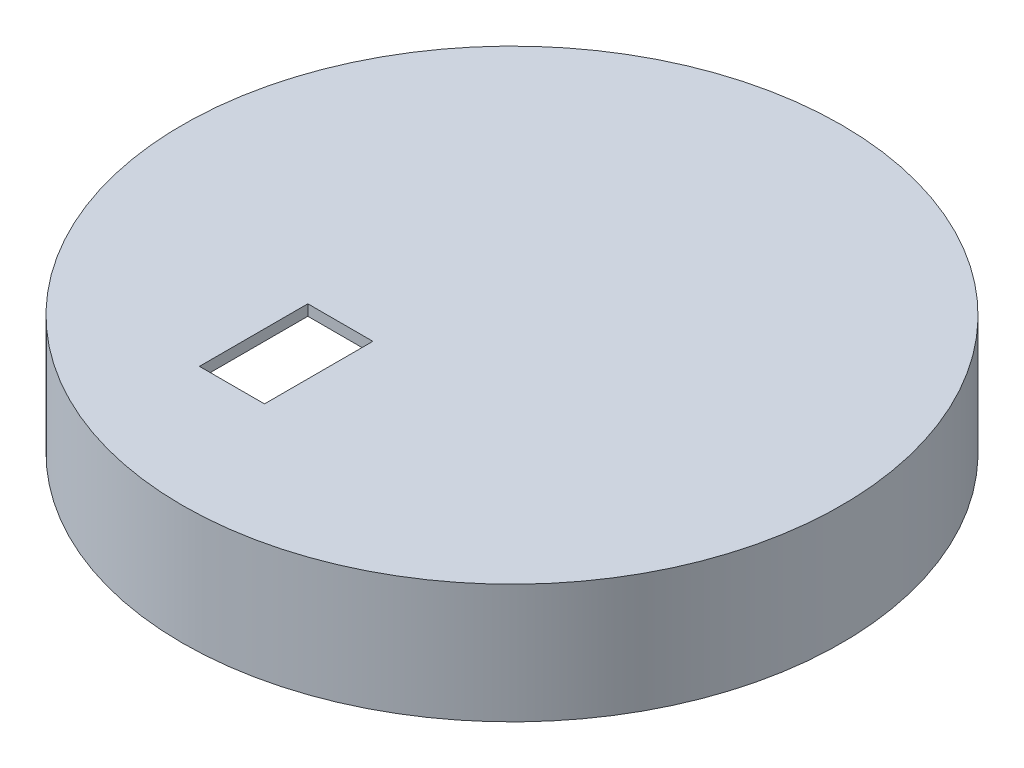
ISO-10303-21;
HEADER;
FILE_DESCRIPTION(('STEP AP214'),'2;1');
FILE_NAME('part.step','',(''),(''),'','','');
FILE_SCHEMA(('AUTOMOTIVE_DESIGN { 1 0 10303 214 1 1 1 1 }'));
ENDSEC;
DATA;
#1=APPLICATION_CONTEXT('core data for automotive mechanical design processes');
#2=APPLICATION_PROTOCOL_DEFINITION('international standard','automotive_design',2000,#1);
#3=PRODUCT_CONTEXT('',#1,'mechanical');
#4=PRODUCT('Part','Part','',(#3));
#5=PRODUCT_RELATED_PRODUCT_CATEGORY('part','',(#4));
#6=PRODUCT_DEFINITION_FORMATION('','',#4);
#7=PRODUCT_DEFINITION_CONTEXT('part definition',#1,'design');
#8=PRODUCT_DEFINITION('design','',#6,#7);
#9=PRODUCT_DEFINITION_SHAPE('','',#8);
#10=(LENGTH_UNIT() NAMED_UNIT(*) SI_UNIT(.MILLI.,.METRE.));
#11=(NAMED_UNIT(*) PLANE_ANGLE_UNIT() SI_UNIT($,.RADIAN.));
#12=(NAMED_UNIT(*) SI_UNIT($,.STERADIAN.) SOLID_ANGLE_UNIT());
#13=UNCERTAINTY_MEASURE_WITH_UNIT(LENGTH_MEASURE(1.E-05),#10,'distance_accuracy_value','');
#14=(GEOMETRIC_REPRESENTATION_CONTEXT(3) GLOBAL_UNCERTAINTY_ASSIGNED_CONTEXT((#13)) GLOBAL_UNIT_ASSIGNED_CONTEXT((#10,
#11,#12)) REPRESENTATION_CONTEXT('',''));
#15=CARTESIAN_POINT('',(0.,0.,0.));
#16=DIRECTION('',(0.,0.,1.));
#17=DIRECTION('',(1.,0.,0.));
#18=AXIS2_PLACEMENT_3D('',#15,#16,#17);
#19=CARTESIAN_POINT('',(0.,10.,0.));
#20=DIRECTION('',(0.,-1.,0.));
#21=DIRECTION('',(0.,0.,-1.));
#22=AXIS2_PLACEMENT_3D('',#19,#20,#21);
#23=CYLINDRICAL_SURFACE('',#22,28.405);
#24=CARTESIAN_POINT('',(0.,10.,0.));
#25=DIRECTION('',(0.,1.,0.));
#26=DIRECTION('',(0.,0.,1.));
#27=AXIS2_PLACEMENT_3D('',#24,#25,#26);
#28=CIRCLE('',#27,28.405);
#29=CARTESIAN_POINT('',(-28.1267895308821,10.,3.96582093461893));
#30=VERTEX_POINT('',#29);
#31=CARTESIAN_POINT('',(28.1267895308821,10.,3.96582093461893));
#32=VERTEX_POINT('',#31);
#33=EDGE_CURVE('E178',#30,#32,#28,.T.);
#34=ORIENTED_EDGE('',*,*,#33,.T.);
#35=DIRECTION('',(0.,1.,0.));
#36=VECTOR('',#35,1.);
#37=CARTESIAN_POINT('',(28.1267895308821,-9.32952303175249,3.96582093461893));
#38=LINE('',#37,#36);
#39=CARTESIAN_POINT('',(28.1267895308821,0.,3.96582093461894));
#40=VERTEX_POINT('',#39);
#41=EDGE_CURVE('E157',#40,#32,#38,.T.);
#42=ORIENTED_EDGE('',*,*,#41,.F.);
#43=CARTESIAN_POINT('',(0.,0.,0.));
#44=DIRECTION('',(0.,1.,0.));
#45=DIRECTION('',(0.,0.,1.));
#46=AXIS2_PLACEMENT_3D('',#43,#44,#45);
#47=CIRCLE('',#46,28.405);
#48=CARTESIAN_POINT('',(-28.1267895308821,0.,3.96582093461893));
#49=VERTEX_POINT('',#48);
#50=EDGE_CURVE('E45',#49,#40,#47,.T.);
#51=ORIENTED_EDGE('',*,*,#50,.F.);
#52=DIRECTION('',(0.,1.,0.));
#53=VECTOR('',#52,1.);
#54=CARTESIAN_POINT('',(-28.1267895308821,-9.32952303175249,3.96582093461893));
#55=LINE('',#54,#53);
#56=EDGE_CURVE('E167',#49,#30,#55,.T.);
#57=ORIENTED_EDGE('',*,*,#56,.T.);
#58=EDGE_LOOP('',(#34,#42,#51,#57));
#59=FACE_BOUND('',#58,.T.);
#60=ADVANCED_FACE('F37',(#59),#23,.F.);
#61=CARTESIAN_POINT('',(28.1267895308821,0.,-3.96582093461894));
#62=VERTEX_POINT('',#61);
#63=CARTESIAN_POINT('',(-28.1267895308821,0.,-3.96582093461893));
#64=VERTEX_POINT('',#63);
#65=EDGE_CURVE('E180',#62,#64,#47,.T.);
#66=ORIENTED_EDGE('',*,*,#65,.F.);
#67=DIRECTION('',(0.,1.,0.));
#68=VECTOR('',#67,1.);
#69=CARTESIAN_POINT('',(28.1267895308821,-9.32952303175249,-3.96582093461893));
#70=LINE('',#69,#68);
#71=CARTESIAN_POINT('',(28.1267895308821,10.,-3.96582093461893));
#72=VERTEX_POINT('',#71);
#73=EDGE_CURVE('E154',#62,#72,#70,.T.);
#74=ORIENTED_EDGE('',*,*,#73,.T.);
#75=CARTESIAN_POINT('',(-28.1267895308821,10.,-3.96582093461893));
#76=VERTEX_POINT('',#75);
#77=EDGE_CURVE('E177',#72,#76,#28,.T.);
#78=ORIENTED_EDGE('',*,*,#77,.T.);
#79=DIRECTION('',(0.,1.,0.));
#80=VECTOR('',#79,1.);
#81=CARTESIAN_POINT('',(-28.1267895308821,-9.32952303175249,-3.96582093461893));
#82=LINE('',#81,#80);
#83=EDGE_CURVE('E170',#64,#76,#82,.T.);
#84=ORIENTED_EDGE('',*,*,#83,.F.);
#85=EDGE_LOOP('',(#66,#74,#78,#84));
#86=FACE_BOUND('',#85,.T.);
#87=ADVANCED_FACE('F193',(#86),#23,.F.);
#88=CARTESIAN_POINT('',(0.,10.,0.));
#89=DIRECTION('',(0.,1.,0.));
#90=DIRECTION('',(0.,0.,1.));
#91=AXIS2_PLACEMENT_3D('',#88,#89,#90);
#92=PLANE('',#91);
#93=DIRECTION('',(1.,0.,0.));
#94=VECTOR('',#93,1.);
#95=CARTESIAN_POINT('',(0.,10.,18.5083099009989));
#96=LINE('',#95,#94);
#97=CARTESIAN_POINT('',(-10.3287789718393,10.,18.5083099009989));
#98=VERTEX_POINT('',#97);
#99=CARTESIAN_POINT('',(-4.32877897183926,10.,18.5083099009989));
#100=VERTEX_POINT('',#99);
#101=EDGE_CURVE('E133',#98,#100,#96,.T.);
#102=ORIENTED_EDGE('',*,*,#101,.T.);
#103=DIRECTION('',(0.,0.,-1.));
#104=VECTOR('',#103,1.);
#105=CARTESIAN_POINT('',(-4.32877897183926,10.,0.));
#106=LINE('',#105,#104);
#107=CARTESIAN_POINT('',(-4.32877897183926,10.,8.50830990099894));
#108=VERTEX_POINT('',#107);
#109=EDGE_CURVE('E136',#100,#108,#106,.T.);
#110=ORIENTED_EDGE('',*,*,#109,.T.);
#111=DIRECTION('',(-1.,0.,0.));
#112=VECTOR('',#111,1.);
#113=CARTESIAN_POINT('',(0.,10.,8.50830990099894));
#114=LINE('',#113,#112);
#115=CARTESIAN_POINT('',(-10.3287789718393,10.,8.50830990099894));
#116=VERTEX_POINT('',#115);
#117=EDGE_CURVE('E128',#108,#116,#114,.T.);
#118=ORIENTED_EDGE('',*,*,#117,.T.);
#119=DIRECTION('',(0.,0.,1.));
#120=VECTOR('',#119,1.);
#121=CARTESIAN_POINT('',(-10.3287789718393,10.,0.));
#122=LINE('',#121,#120);
#123=EDGE_CURVE('E108',#116,#98,#122,.T.);
#124=ORIENTED_EDGE('',*,*,#123,.T.);
#125=EDGE_LOOP('',(#102,#110,#118,#124));
#126=FACE_BOUND('',#125,.T.);
#127=CARTESIAN_POINT('',(27.605,10.,0.));
#128=DIRECTION('',(0.,-1.,0.));
#129=DIRECTION('',(0.,0.,-1.));
#130=AXIS2_PLACEMENT_3D('',#127,#128,#129);
#131=CIRCLE('',#130,4.);
#132=EDGE_CURVE('E149',#32,#72,#131,.T.);
#133=ORIENTED_EDGE('',*,*,#132,.F.);
#134=ORIENTED_EDGE('',*,*,#33,.F.);
#135=CARTESIAN_POINT('',(-27.605,10.,0.));
#136=DIRECTION('',(0.,-1.,0.));
#137=DIRECTION('',(0.,0.,-1.));
#138=AXIS2_PLACEMENT_3D('',#135,#136,#137);
#139=CIRCLE('',#138,4.);
#140=EDGE_CURVE('E163',#30,#76,#139,.F.);
#141=ORIENTED_EDGE('',*,*,#140,.T.);
#142=ORIENTED_EDGE('',*,*,#77,.F.);
#143=EDGE_LOOP('',(#133,#134,#141,#142));
#144=FACE_BOUND('',#143,.T.);
#145=ADVANCED_FACE('F195',(#126,#144),#92,.F.);
#146=CARTESIAN_POINT('',(0.,0.,0.));
#147=DIRECTION('',(0.,1.,0.));
#148=DIRECTION('',(0.,0.,1.));
#149=AXIS2_PLACEMENT_3D('',#146,#147,#148);
#150=PLANE('',#149);
#151=CARTESIAN_POINT('',(27.605,0.,0.));
#152=DIRECTION('',(0.,-1.,0.));
#153=DIRECTION('',(0.,0.,-1.));
#154=AXIS2_PLACEMENT_3D('',#151,#152,#153);
#155=CIRCLE('',#154,1.5);
#156=CARTESIAN_POINT('',(27.605,0.,-1.5));
#157=VERTEX_POINT('',#156);
#158=EDGE_CURVE('E139',#157,#157,#155,.T.);
#159=ORIENTED_EDGE('',*,*,#158,.F.);
#160=EDGE_LOOP('',(#159));
#161=FACE_BOUND('',#160,.T.);
#162=CARTESIAN_POINT('',(-27.605,0.,0.));
#163=DIRECTION('',(0.,-1.,0.));
#164=DIRECTION('',(0.,0.,-1.));
#165=AXIS2_PLACEMENT_3D('',#162,#163,#164);
#166=CIRCLE('',#165,1.5);
#167=CARTESIAN_POINT('',(-27.605,0.,-1.5));
#168=VERTEX_POINT('',#167);
#169=EDGE_CURVE('E143',#168,#168,#166,.F.);
#170=ORIENTED_EDGE('',*,*,#169,.T.);
#171=EDGE_LOOP('',(#170));
#172=FACE_BOUND('',#171,.T.);
#173=CARTESIAN_POINT('',(0.,0.,0.));
#174=DIRECTION('',(0.,1.,0.));
#175=DIRECTION('',(0.,0.,1.));
#176=AXIS2_PLACEMENT_3D('',#173,#174,#175);
#177=CIRCLE('',#176,30.405);
#178=CARTESIAN_POINT('',(0.,0.,30.405));
#179=VERTEX_POINT('',#178);
#180=EDGE_CURVE('E11',#179,#179,#177,.T.);
#181=ORIENTED_EDGE('',*,*,#180,.F.);
#182=EDGE_LOOP('',(#181));
#183=FACE_BOUND('',#182,.T.);
#184=ORIENTED_EDGE('',*,*,#50,.T.);
#185=CARTESIAN_POINT('',(27.605,0.,0.));
#186=DIRECTION('',(0.,1.,0.));
#187=DIRECTION('',(0.,0.,1.));
#188=AXIS2_PLACEMENT_3D('',#185,#186,#187);
#189=CIRCLE('',#188,4.);
#190=EDGE_CURVE('E160',#62,#40,#189,.T.);
#191=ORIENTED_EDGE('',*,*,#190,.F.);
#192=ORIENTED_EDGE('',*,*,#65,.T.);
#193=CARTESIAN_POINT('',(-27.605,0.,0.));
#194=DIRECTION('',(0.,1.,0.));
#195=DIRECTION('',(0.,0.,1.));
#196=AXIS2_PLACEMENT_3D('',#193,#194,#195);
#197=CIRCLE('',#196,4.);
#198=EDGE_CURVE('E164',#64,#49,#197,.F.);
#199=ORIENTED_EDGE('',*,*,#198,.T.);
#200=EDGE_LOOP('',(#184,#191,#192,#199));
#201=FACE_BOUND('',#200,.T.);
#202=ADVANCED_FACE('F186',(#161,#172,#183,#201),#150,.F.);
#203=CARTESIAN_POINT('',(0.,10.,0.));
#204=DIRECTION('',(0.,-1.,0.));
#205=DIRECTION('',(0.,0.,-1.));
#206=AXIS2_PLACEMENT_3D('',#203,#204,#205);
#207=CYLINDRICAL_SURFACE('',#206,30.405);
#208=ORIENTED_EDGE('',*,*,#180,.T.);
#209=EDGE_LOOP('',(#208));
#210=FACE_BOUND('',#209,.T.);
#211=CARTESIAN_POINT('',(0.,11.,0.));
#212=DIRECTION('',(0.,1.,0.));
#213=DIRECTION('',(0.,0.,1.));
#214=AXIS2_PLACEMENT_3D('',#211,#212,#213);
#215=CIRCLE('',#214,30.405);
#216=CARTESIAN_POINT('',(0.,11.,30.405));
#217=VERTEX_POINT('',#216);
#218=EDGE_CURVE('E166',#217,#217,#215,.T.);
#219=ORIENTED_EDGE('',*,*,#218,.F.);
#220=EDGE_LOOP('',(#219));
#221=FACE_BOUND('',#220,.T.);
#222=ADVANCED_FACE('F39',(#210,#221),#207,.T.);
#223=CARTESIAN_POINT('',(0.,11.,0.));
#224=DIRECTION('',(0.,1.,0.));
#225=DIRECTION('',(0.,0.,1.));
#226=AXIS2_PLACEMENT_3D('',#223,#224,#225);
#227=PLANE('',#226);
#228=DIRECTION('',(0.,0.,-1.));
#229=VECTOR('',#228,1.);
#230=CARTESIAN_POINT('',(-4.32877897183926,11.,18.5083099009989));
#231=LINE('',#230,#229);
#232=CARTESIAN_POINT('',(-4.32877897183926,11.,18.5083099009989));
#233=VERTEX_POINT('',#232);
#234=CARTESIAN_POINT('',(-4.32877897183926,11.,8.50830990099894));
#235=VERTEX_POINT('',#234);
#236=EDGE_CURVE('E60',#233,#235,#231,.T.);
#237=ORIENTED_EDGE('',*,*,#236,.F.);
#238=DIRECTION('',(1.,0.,0.));
#239=VECTOR('',#238,1.);
#240=CARTESIAN_POINT('',(-10.3287789718393,11.,18.5083099009989));
#241=LINE('',#240,#239);
#242=CARTESIAN_POINT('',(-10.3287789718393,11.,18.5083099009989));
#243=VERTEX_POINT('',#242);
#244=EDGE_CURVE('E121',#243,#233,#241,.T.);
#245=ORIENTED_EDGE('',*,*,#244,.F.);
#246=DIRECTION('',(0.,0.,1.));
#247=VECTOR('',#246,1.);
#248=CARTESIAN_POINT('',(-10.3287789718393,11.,18.5083099009989));
#249=LINE('',#248,#247);
#250=CARTESIAN_POINT('',(-10.3287789718393,11.,8.50830990099894));
#251=VERTEX_POINT('',#250);
#252=EDGE_CURVE('E105',#251,#243,#249,.T.);
#253=ORIENTED_EDGE('',*,*,#252,.F.);
#254=DIRECTION('',(-1.,0.,0.));
#255=VECTOR('',#254,1.);
#256=CARTESIAN_POINT('',(-10.3287789718393,11.,8.50830990099894));
#257=LINE('',#256,#255);
#258=EDGE_CURVE('E114',#235,#251,#257,.T.);
#259=ORIENTED_EDGE('',*,*,#258,.F.);
#260=EDGE_LOOP('',(#237,#245,#253,#259));
#261=FACE_BOUND('',#260,.T.);
#262=ORIENTED_EDGE('',*,*,#218,.T.);
#263=EDGE_LOOP('',(#262));
#264=FACE_BOUND('',#263,.T.);
#265=ADVANCED_FACE('F118',(#261,#264),#227,.T.);
#266=CARTESIAN_POINT('',(-27.605,-9.32952303175249,0.));
#267=DIRECTION('',(0.,1.,0.));
#268=DIRECTION('',(0.,0.,1.));
#269=AXIS2_PLACEMENT_3D('',#266,#267,#268);
#270=CYLINDRICAL_SURFACE('',#269,4.);
#271=ORIENTED_EDGE('',*,*,#198,.F.);
#272=ORIENTED_EDGE('',*,*,#83,.T.);
#273=ORIENTED_EDGE('',*,*,#140,.F.);
#274=ORIENTED_EDGE('',*,*,#56,.F.);
#275=EDGE_LOOP('',(#271,#272,#273,#274));
#276=FACE_BOUND('',#275,.T.);
#277=ADVANCED_FACE('F192',(#276),#270,.T.);
#278=CARTESIAN_POINT('',(27.605,-9.32952303175249,0.));
#279=DIRECTION('',(0.,1.,0.));
#280=DIRECTION('',(0.,0.,1.));
#281=AXIS2_PLACEMENT_3D('',#278,#279,#280);
#282=CYLINDRICAL_SURFACE('',#281,4.);
#283=ORIENTED_EDGE('',*,*,#73,.F.);
#284=ORIENTED_EDGE('',*,*,#190,.T.);
#285=ORIENTED_EDGE('',*,*,#41,.T.);
#286=ORIENTED_EDGE('',*,*,#132,.T.);
#287=EDGE_LOOP('',(#283,#284,#285,#286));
#288=FACE_BOUND('',#287,.T.);
#289=ADVANCED_FACE('F199',(#288),#282,.T.);
#290=CARTESIAN_POINT('',(-27.605,10.,0.));
#291=DIRECTION('',(0.,-1.,0.));
#292=DIRECTION('',(0.,0.,-1.));
#293=AXIS2_PLACEMENT_3D('',#290,#291,#292);
#294=CYLINDRICAL_SURFACE('',#293,1.5);
#295=CARTESIAN_POINT('',(-27.605,10.,0.));
#296=DIRECTION('',(0.,-1.,0.));
#297=DIRECTION('',(0.,0.,-1.));
#298=AXIS2_PLACEMENT_3D('',#295,#296,#297);
#299=CIRCLE('',#298,1.5);
#300=CARTESIAN_POINT('',(-27.605,10.,-1.5));
#301=VERTEX_POINT('',#300);
#302=EDGE_CURVE('E146',#301,#301,#299,.F.);
#303=ORIENTED_EDGE('',*,*,#302,.T.);
#304=EDGE_LOOP('',(#303));
#305=FACE_BOUND('',#304,.T.);
#306=ORIENTED_EDGE('',*,*,#169,.F.);
#307=EDGE_LOOP('',(#306));
#308=FACE_BOUND('',#307,.T.);
#309=ADVANCED_FACE('F201',(#305,#308),#294,.F.);
#310=CARTESIAN_POINT('',(0.,10.,0.));
#311=DIRECTION('',(0.,-1.,0.));
#312=DIRECTION('',(0.,0.,-1.));
#313=AXIS2_PLACEMENT_3D('',#310,#311,#312);
#314=PLANE('',#313);
#315=ORIENTED_EDGE('',*,*,#302,.F.);
#316=EDGE_LOOP('',(#315));
#317=FACE_BOUND('',#316,.T.);
#318=ADVANCED_FACE('F207',(#317),#314,.T.);
#319=CARTESIAN_POINT('',(27.605,10.,0.));
#320=DIRECTION('',(0.,-1.,0.));
#321=DIRECTION('',(0.,0.,-1.));
#322=AXIS2_PLACEMENT_3D('',#319,#320,#321);
#323=CYLINDRICAL_SURFACE('',#322,1.5);
#324=CARTESIAN_POINT('',(27.605,10.,0.));
#325=DIRECTION('',(0.,-1.,0.));
#326=DIRECTION('',(0.,0.,-1.));
#327=AXIS2_PLACEMENT_3D('',#324,#325,#326);
#328=CIRCLE('',#327,1.5);
#329=CARTESIAN_POINT('',(27.605,10.,-1.5));
#330=VERTEX_POINT('',#329);
#331=EDGE_CURVE('E140',#330,#330,#328,.T.);
#332=ORIENTED_EDGE('',*,*,#331,.F.);
#333=EDGE_LOOP('',(#332));
#334=FACE_BOUND('',#333,.T.);
#335=ORIENTED_EDGE('',*,*,#158,.T.);
#336=EDGE_LOOP('',(#335));
#337=FACE_BOUND('',#336,.T.);
#338=ADVANCED_FACE('F271',(#334,#337),#323,.F.);
#339=CARTESIAN_POINT('',(0.,10.,0.));
#340=DIRECTION('',(0.,-1.,0.));
#341=DIRECTION('',(0.,0.,-1.));
#342=AXIS2_PLACEMENT_3D('',#339,#340,#341);
#343=PLANE('',#342);
#344=ORIENTED_EDGE('',*,*,#331,.T.);
#345=EDGE_LOOP('',(#344));
#346=FACE_BOUND('',#345,.T.);
#347=ADVANCED_FACE('F281',(#346),#343,.T.);
#348=CARTESIAN_POINT('',(-4.32877897183926,0.999999999999999,18.5083099009989));
#349=DIRECTION('',(1.,0.,0.));
#350=DIRECTION('',(0.,0.,-1.));
#351=AXIS2_PLACEMENT_3D('',#348,#349,#350);
#352=PLANE('',#351);
#353=DIRECTION('',(0.,1.,0.));
#354=VECTOR('',#353,1.);
#355=CARTESIAN_POINT('',(-4.32877897183926,0.999999999999999,18.5083099009989));
#356=LINE('',#355,#354);
#357=EDGE_CURVE('E126',#100,#233,#356,.T.);
#358=ORIENTED_EDGE('',*,*,#357,.T.);
#359=ORIENTED_EDGE('',*,*,#236,.T.);
#360=DIRECTION('',(0.,1.,0.));
#361=VECTOR('',#360,1.);
#362=CARTESIAN_POINT('',(-4.32877897183926,0.999999999999999,8.50830990099894));
#363=LINE('',#362,#361);
#364=EDGE_CURVE('E111',#108,#235,#363,.T.);
#365=ORIENTED_EDGE('',*,*,#364,.F.);
#366=ORIENTED_EDGE('',*,*,#109,.F.);
#367=EDGE_LOOP('',(#358,#359,#365,#366));
#368=FACE_BOUND('',#367,.T.);
#369=ADVANCED_FACE('F291',(#368),#352,.F.);
#370=CARTESIAN_POINT('',(-10.3287789718393,0.999999999999999,18.5083099009989));
#371=DIRECTION('',(0.,0.,1.));
#372=DIRECTION('',(1.,0.,0.));
#373=AXIS2_PLACEMENT_3D('',#370,#371,#372);
#374=PLANE('',#373);
#375=DIRECTION('',(0.,1.,0.));
#376=VECTOR('',#375,1.);
#377=CARTESIAN_POINT('',(-10.3287789718393,0.999999999999999,18.5083099009989));
#378=LINE('',#377,#376);
#379=EDGE_CURVE('E110',#98,#243,#378,.T.);
#380=ORIENTED_EDGE('',*,*,#379,.T.);
#381=ORIENTED_EDGE('',*,*,#244,.T.);
#382=ORIENTED_EDGE('',*,*,#357,.F.);
#383=ORIENTED_EDGE('',*,*,#101,.F.);
#384=EDGE_LOOP('',(#380,#381,#382,#383));
#385=FACE_BOUND('',#384,.T.);
#386=ADVANCED_FACE('F327',(#385),#374,.F.);
#387=CARTESIAN_POINT('',(-10.3287789718393,0.999999999999999,18.5083099009989));
#388=DIRECTION('',(-1.,0.,0.));
#389=DIRECTION('',(0.,0.,1.));
#390=AXIS2_PLACEMENT_3D('',#387,#388,#389);
#391=PLANE('',#390);
#392=DIRECTION('',(0.,1.,0.));
#393=VECTOR('',#392,1.);
#394=CARTESIAN_POINT('',(-10.3287789718393,0.999999999999999,8.50830990099894));
#395=LINE('',#394,#393);
#396=EDGE_CURVE('E52',#116,#251,#395,.T.);
#397=ORIENTED_EDGE('',*,*,#396,.T.);
#398=ORIENTED_EDGE('',*,*,#252,.T.);
#399=ORIENTED_EDGE('',*,*,#379,.F.);
#400=ORIENTED_EDGE('',*,*,#123,.F.);
#401=EDGE_LOOP('',(#397,#398,#399,#400));
#402=FACE_BOUND('',#401,.T.);
#403=ADVANCED_FACE('F102',(#402),#391,.F.);
#404=CARTESIAN_POINT('',(-10.3287789718393,0.999999999999999,8.50830990099894));
#405=DIRECTION('',(0.,0.,-1.));
#406=DIRECTION('',(-1.,0.,0.));
#407=AXIS2_PLACEMENT_3D('',#404,#405,#406);
#408=PLANE('',#407);
#409=ORIENTED_EDGE('',*,*,#364,.T.);
#410=ORIENTED_EDGE('',*,*,#258,.T.);
#411=ORIENTED_EDGE('',*,*,#396,.F.);
#412=ORIENTED_EDGE('',*,*,#117,.F.);
#413=EDGE_LOOP('',(#409,#410,#411,#412));
#414=FACE_BOUND('',#413,.T.);
#415=ADVANCED_FACE('F115',(#414),#408,.F.);
#416=CLOSED_SHELL('',(#60,#87,#145,#202,#222,#265,#277,#289,#309,#318,#338,#347,#369,#386,#403,#415));
#417=MANIFOLD_SOLID_BREP('B2',#416);
#418=ADVANCED_BREP_SHAPE_REPRESENTATION('',(#18,#417),#14);
#419=SHAPE_DEFINITION_REPRESENTATION(#9,#418);
ENDSEC;
END-ISO-10303-21;
